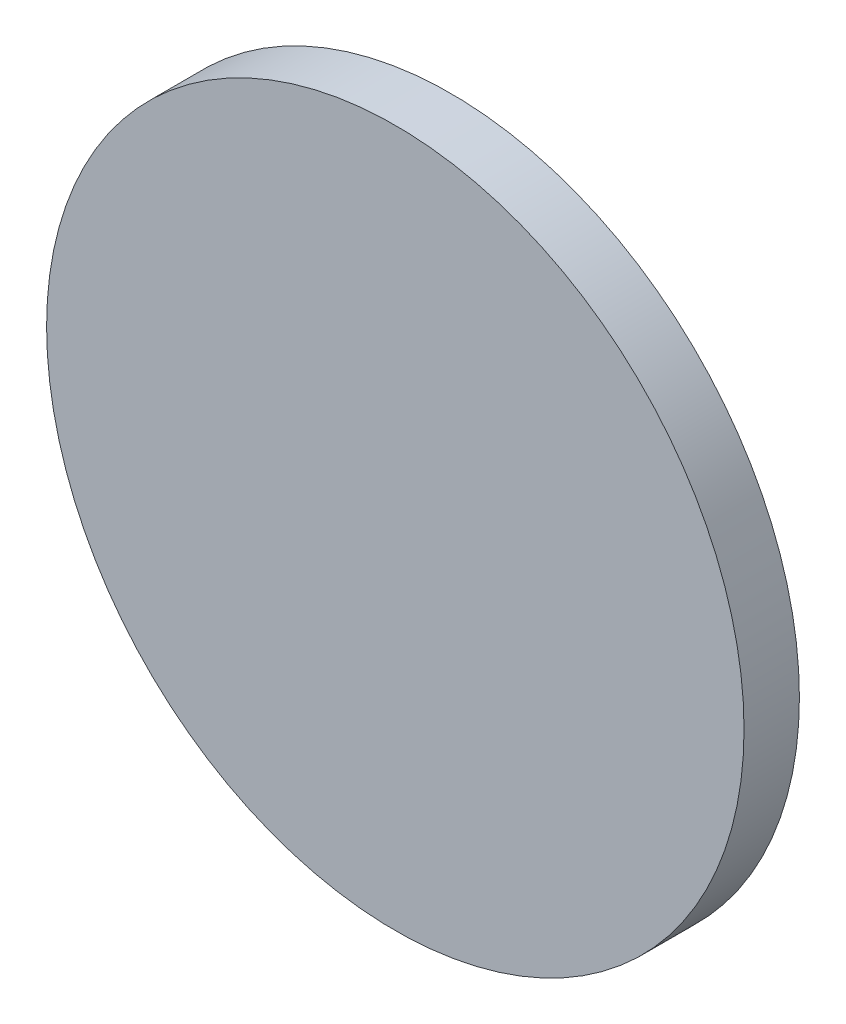
ISO-10303-21;
HEADER;
FILE_DESCRIPTION(('STEP AP214'),'2;1');
FILE_NAME('part.step','',(''),(''),'','','');
FILE_SCHEMA(('AUTOMOTIVE_DESIGN { 1 0 10303 214 1 1 1 1 }'));
ENDSEC;
DATA;
#1=APPLICATION_CONTEXT('core data for automotive mechanical design processes');
#2=APPLICATION_PROTOCOL_DEFINITION('international standard','automotive_design',2000,#1);
#3=PRODUCT_CONTEXT('',#1,'mechanical');
#4=PRODUCT('Part','Part','',(#3));
#5=PRODUCT_RELATED_PRODUCT_CATEGORY('part','',(#4));
#6=PRODUCT_DEFINITION_FORMATION('','',#4);
#7=PRODUCT_DEFINITION_CONTEXT('part definition',#1,'design');
#8=PRODUCT_DEFINITION('design','',#6,#7);
#9=PRODUCT_DEFINITION_SHAPE('','',#8);
#10=(LENGTH_UNIT() NAMED_UNIT(*) SI_UNIT(.MILLI.,.METRE.));
#11=(NAMED_UNIT(*) PLANE_ANGLE_UNIT() SI_UNIT($,.RADIAN.));
#12=(NAMED_UNIT(*) SI_UNIT($,.STERADIAN.) SOLID_ANGLE_UNIT());
#13=UNCERTAINTY_MEASURE_WITH_UNIT(LENGTH_MEASURE(1.E-05),#10,'distance_accuracy_value','');
#14=(GEOMETRIC_REPRESENTATION_CONTEXT(3) GLOBAL_UNCERTAINTY_ASSIGNED_CONTEXT((#13)) GLOBAL_UNIT_ASSIGNED_CONTEXT((#10,
#11,#12)) REPRESENTATION_CONTEXT('',''));
#15=CARTESIAN_POINT('',(0.,0.,0.));
#16=DIRECTION('',(0.,0.,1.));
#17=DIRECTION('',(1.,0.,0.));
#18=AXIS2_PLACEMENT_3D('',#15,#16,#17);
#19=CARTESIAN_POINT('',(0.,0.,3.175));
#20=DIRECTION('',(0.,0.,-1.));
#21=DIRECTION('',(-1.,0.,0.));
#22=AXIS2_PLACEMENT_3D('',#19,#20,#21);
#23=CYLINDRICAL_SURFACE('',#22,20.);
#24=CARTESIAN_POINT('',(0.,0.,3.175));
#25=DIRECTION('',(0.,0.,1.));
#26=DIRECTION('',(1.,0.,0.));
#27=AXIS2_PLACEMENT_3D('',#24,#25,#26);
#28=CIRCLE('',#27,20.);
#29=CARTESIAN_POINT('',(20.,0.,3.175));
#30=VERTEX_POINT('',#29);
#31=EDGE_CURVE('E10',#30,#30,#28,.T.);
#32=ORIENTED_EDGE('',*,*,#31,.F.);
#33=EDGE_LOOP('',(#32));
#34=FACE_BOUND('',#33,.T.);
#35=CARTESIAN_POINT('',(0.,0.,0.));
#36=DIRECTION('',(0.,0.,1.));
#37=DIRECTION('',(1.,0.,0.));
#38=AXIS2_PLACEMENT_3D('',#35,#36,#37);
#39=CIRCLE('',#38,20.);
#40=CARTESIAN_POINT('',(20.,0.,0.));
#41=VERTEX_POINT('',#40);
#42=EDGE_CURVE('E40',#41,#41,#39,.T.);
#43=ORIENTED_EDGE('',*,*,#42,.T.);
#44=EDGE_LOOP('',(#43));
#45=FACE_BOUND('',#44,.T.);
#46=ADVANCED_FACE('F37',(#34,#45),#23,.T.);
#47=CARTESIAN_POINT('',(0.,0.,3.175));
#48=DIRECTION('',(0.,0.,1.));
#49=DIRECTION('',(1.,0.,0.));
#50=AXIS2_PLACEMENT_3D('',#47,#48,#49);
#51=PLANE('',#50);
#52=ORIENTED_EDGE('',*,*,#31,.T.);
#53=EDGE_LOOP('',(#52));
#54=FACE_BOUND('',#53,.T.);
#55=ADVANCED_FACE('F54',(#54),#51,.T.);
#56=CARTESIAN_POINT('',(0.,0.,0.));
#57=DIRECTION('',(0.,0.,1.));
#58=DIRECTION('',(1.,0.,0.));
#59=AXIS2_PLACEMENT_3D('',#56,#57,#58);
#60=PLANE('',#59);
#61=ORIENTED_EDGE('',*,*,#42,.F.);
#62=EDGE_LOOP('',(#61));
#63=FACE_BOUND('',#62,.T.);
#64=ADVANCED_FACE('F52',(#63),#60,.F.);
#65=CLOSED_SHELL('',(#46,#55,#64));
#66=MANIFOLD_SOLID_BREP('B2',#65);
#67=ADVANCED_BREP_SHAPE_REPRESENTATION('',(#18,#66),#14);
#68=SHAPE_DEFINITION_REPRESENTATION(#9,#67);
ENDSEC;
END-ISO-10303-21;
